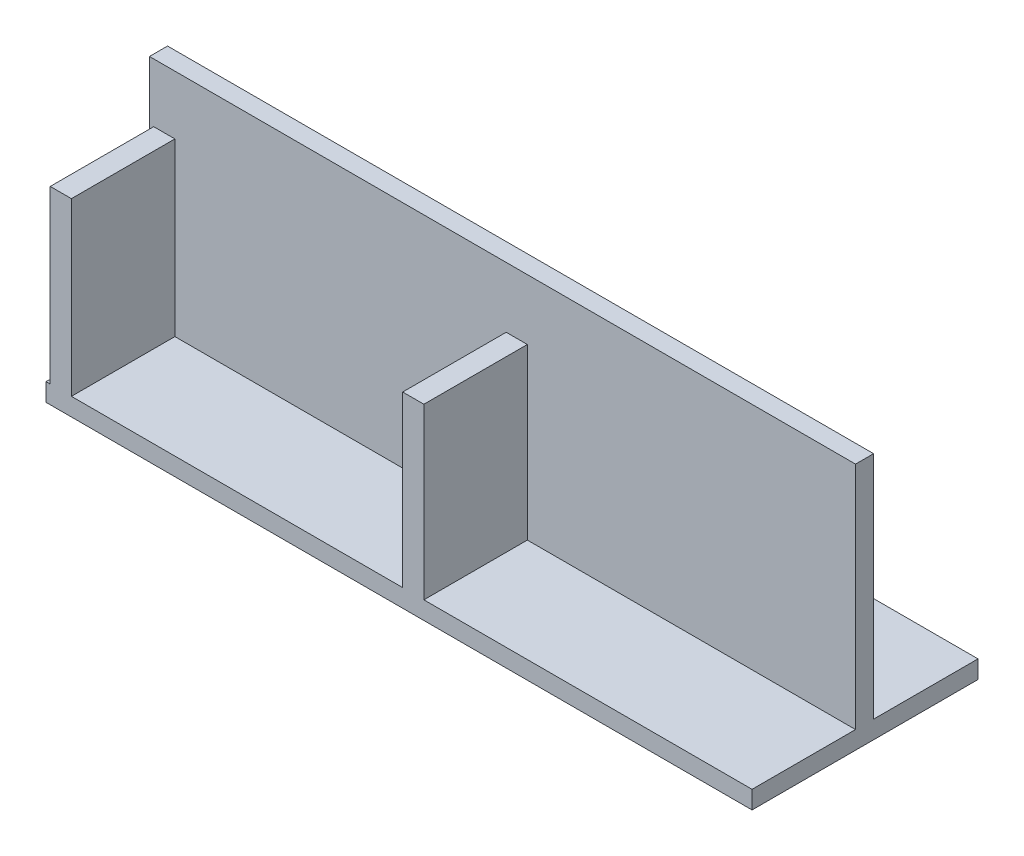
ISO-10303-21;
HEADER;
FILE_DESCRIPTION(('STEP AP214'),'2;1');
FILE_NAME('part.step','',(''),(''),'','','');
FILE_SCHEMA(('AUTOMOTIVE_DESIGN { 1 0 10303 214 1 1 1 1 }'));
ENDSEC;
DATA;
#1=APPLICATION_CONTEXT('core data for automotive mechanical design processes');
#2=APPLICATION_PROTOCOL_DEFINITION('international standard','automotive_design',2000,#1);
#3=PRODUCT_CONTEXT('',#1,'mechanical');
#4=PRODUCT('Part','Part','',(#3));
#5=PRODUCT_RELATED_PRODUCT_CATEGORY('part','',(#4));
#6=PRODUCT_DEFINITION_FORMATION('','',#4);
#7=PRODUCT_DEFINITION_CONTEXT('part definition',#1,'design');
#8=PRODUCT_DEFINITION('design','',#6,#7);
#9=PRODUCT_DEFINITION_SHAPE('','',#8);
#10=(LENGTH_UNIT() NAMED_UNIT(*) SI_UNIT(.MILLI.,.METRE.));
#11=(NAMED_UNIT(*) PLANE_ANGLE_UNIT() SI_UNIT($,.RADIAN.));
#12=(NAMED_UNIT(*) SI_UNIT($,.STERADIAN.) SOLID_ANGLE_UNIT());
#13=UNCERTAINTY_MEASURE_WITH_UNIT(LENGTH_MEASURE(1.E-05),#10,'distance_accuracy_value','');
#14=(GEOMETRIC_REPRESENTATION_CONTEXT(3) GLOBAL_UNCERTAINTY_ASSIGNED_CONTEXT((#13)) GLOBAL_UNIT_ASSIGNED_CONTEXT((#10,
#11,#12)) REPRESENTATION_CONTEXT('',''));
#15=CARTESIAN_POINT('',(0.,0.,0.));
#16=DIRECTION('',(0.,0.,1.));
#17=DIRECTION('',(1.,0.,0.));
#18=AXIS2_PLACEMENT_3D('',#15,#16,#17);
#19=CARTESIAN_POINT('',(0.,8.0518,0.));
#20=DIRECTION('',(0.,-1.,0.));
#21=DIRECTION('',(0.,0.,-1.));
#22=AXIS2_PLACEMENT_3D('',#19,#20,#21);
#23=PLANE('',#22);
#24=DIRECTION('',(0.,0.,-1.));
#25=VECTOR('',#24,1.);
#26=CARTESIAN_POINT('',(169.926,8.0518,0.));
#27=LINE('',#26,#25);
#28=CARTESIAN_POINT('',(169.926,8.0518,0.));
#29=VERTEX_POINT('',#28);
#30=CARTESIAN_POINT('',(169.926,8.0518,-46.5328));
#31=VERTEX_POINT('',#30);
#32=EDGE_CURVE('E173',#29,#31,#27,.T.);
#33=ORIENTED_EDGE('',*,*,#32,.F.);
#34=DIRECTION('',(1.,0.,0.));
#35=VECTOR('',#34,1.);
#36=CARTESIAN_POINT('',(0.,8.0518,0.));
#37=LINE('',#36,#35);
#38=CARTESIAN_POINT('',(317.5,8.0518,0.));
#39=VERTEX_POINT('',#38);
#40=EDGE_CURVE('E160',#29,#39,#37,.T.);
#41=ORIENTED_EDGE('',*,*,#40,.T.);
#42=DIRECTION('',(0.,0.,-1.));
#43=VECTOR('',#42,1.);
#44=CARTESIAN_POINT('',(317.5,8.0518,0.));
#45=LINE('',#44,#43);
#46=CARTESIAN_POINT('',(317.5,8.0518,-46.5328));
#47=VERTEX_POINT('',#46);
#48=EDGE_CURVE('E243',#39,#47,#45,.T.);
#49=ORIENTED_EDGE('',*,*,#48,.T.);
#50=DIRECTION('',(1.,0.,0.));
#51=VECTOR('',#50,1.);
#52=CARTESIAN_POINT('',(0.,8.0518,-46.5328));
#53=LINE('',#52,#51);
#54=EDGE_CURVE('E219',#31,#47,#53,.T.);
#55=ORIENTED_EDGE('',*,*,#54,.F.);
#56=EDGE_LOOP('',(#33,#41,#49,#55));
#57=FACE_BOUND('',#56,.T.);
#58=ADVANCED_FACE('F33',(#57),#23,.F.);
#59=CARTESIAN_POINT('',(11.43,8.0518,0.));
#60=VERTEX_POINT('',#59);
#61=CARTESIAN_POINT('',(160.401,8.0518,0.));
#62=VERTEX_POINT('',#61);
#63=EDGE_CURVE('E242',#60,#62,#37,.T.);
#64=ORIENTED_EDGE('',*,*,#63,.T.);
#65=DIRECTION('',(0.,0.,-1.));
#66=VECTOR('',#65,1.);
#67=CARTESIAN_POINT('',(160.401,8.0518,0.));
#68=LINE('',#67,#66);
#69=CARTESIAN_POINT('',(160.401,8.0518,-46.5328));
#70=VERTEX_POINT('',#69);
#71=EDGE_CURVE('E169',#62,#70,#68,.T.);
#72=ORIENTED_EDGE('',*,*,#71,.T.);
#73=CARTESIAN_POINT('',(11.43,8.0518,-46.5328));
#74=VERTEX_POINT('',#73);
#75=EDGE_CURVE('E222',#74,#70,#53,.T.);
#76=ORIENTED_EDGE('',*,*,#75,.F.);
#77=DIRECTION('',(0.,0.,-1.));
#78=VECTOR('',#77,1.);
#79=CARTESIAN_POINT('',(11.43,8.0518,0.));
#80=LINE('',#79,#78);
#81=EDGE_CURVE('E177',#60,#74,#80,.T.);
#82=ORIENTED_EDGE('',*,*,#81,.F.);
#83=EDGE_LOOP('',(#64,#72,#76,#82));
#84=FACE_BOUND('',#83,.T.);
#85=ADVANCED_FACE('F298',(#84),#23,.F.);
#86=CARTESIAN_POINT('',(0.,111.4298,-46.5328));
#87=DIRECTION('',(0.,0.,-1.));
#88=DIRECTION('',(-1.,0.,0.));
#89=AXIS2_PLACEMENT_3D('',#86,#87,#88);
#90=PLANE('',#89);
#91=ORIENTED_EDGE('',*,*,#75,.T.);
#92=DIRECTION('',(0.,-1.,0.));
#93=VECTOR('',#92,1.);
#94=CARTESIAN_POINT('',(160.401,84.2264,-46.5328));
#95=LINE('',#94,#93);
#96=CARTESIAN_POINT('',(160.401,84.2264,-46.5328));
#97=VERTEX_POINT('',#96);
#98=EDGE_CURVE('E53',#97,#70,#95,.T.);
#99=ORIENTED_EDGE('',*,*,#98,.F.);
#100=DIRECTION('',(1.,0.,0.));
#101=VECTOR('',#100,1.);
#102=CARTESIAN_POINT('',(0.,84.2264,-46.5328));
#103=LINE('',#102,#101);
#104=CARTESIAN_POINT('',(169.926,84.2264,-46.5328));
#105=VERTEX_POINT('',#104);
#106=EDGE_CURVE('E48',#97,#105,#103,.T.);
#107=ORIENTED_EDGE('',*,*,#106,.T.);
#108=DIRECTION('',(0.,-1.,0.));
#109=VECTOR('',#108,1.);
#110=CARTESIAN_POINT('',(169.926,84.2264,-46.5328));
#111=LINE('',#110,#109);
#112=EDGE_CURVE('E165',#105,#31,#111,.T.);
#113=ORIENTED_EDGE('',*,*,#112,.T.);
#114=ORIENTED_EDGE('',*,*,#54,.T.);
#115=DIRECTION('',(0.,-1.,0.));
#116=VECTOR('',#115,1.);
#117=CARTESIAN_POINT('',(317.5,111.4298,-46.5328));
#118=LINE('',#117,#116);
#119=CARTESIAN_POINT('',(317.5,111.4298,-46.5328));
#120=VERTEX_POINT('',#119);
#121=EDGE_CURVE('E225',#120,#47,#118,.T.);
#122=ORIENTED_EDGE('',*,*,#121,.F.);
#123=DIRECTION('',(1.,0.,0.));
#124=VECTOR('',#123,1.);
#125=CARTESIAN_POINT('',(0.,111.4298,-46.5328));
#126=LINE('',#125,#124);
#127=CARTESIAN_POINT('',(0.,111.4298,-46.5328));
#128=VERTEX_POINT('',#127);
#129=EDGE_CURVE('E212',#128,#120,#126,.T.);
#130=ORIENTED_EDGE('',*,*,#129,.F.);
#131=DIRECTION('',(0.,-1.,0.));
#132=VECTOR('',#131,1.);
#133=CARTESIAN_POINT('',(0.,111.4298,-46.5328));
#134=LINE('',#133,#132);
#135=CARTESIAN_POINT('',(0.,8.0518,-46.5328));
#136=VERTEX_POINT('',#135);
#137=EDGE_CURVE('E228',#128,#136,#134,.T.);
#138=ORIENTED_EDGE('',*,*,#137,.T.);
#139=CARTESIAN_POINT('',(1.905,8.0518,-46.5328));
#140=VERTEX_POINT('',#139);
#141=EDGE_CURVE('E210',#136,#140,#53,.T.);
#142=ORIENTED_EDGE('',*,*,#141,.T.);
#143=DIRECTION('',(0.,-1.,0.));
#144=VECTOR('',#143,1.);
#145=CARTESIAN_POINT('',(1.905,85.0392,-46.5328));
#146=LINE('',#145,#144);
#147=CARTESIAN_POINT('',(1.905,85.0392,-46.5328));
#148=VERTEX_POINT('',#147);
#149=EDGE_CURVE('E198',#148,#140,#146,.T.);
#150=ORIENTED_EDGE('',*,*,#149,.F.);
#151=DIRECTION('',(1.,0.,0.));
#152=VECTOR('',#151,1.);
#153=CARTESIAN_POINT('',(0.,85.0392,-46.5328));
#154=LINE('',#153,#152);
#155=CARTESIAN_POINT('',(11.43,85.0392,-46.5328));
#156=VERTEX_POINT('',#155);
#157=EDGE_CURVE('E187',#148,#156,#154,.T.);
#158=ORIENTED_EDGE('',*,*,#157,.T.);
#159=DIRECTION('',(0.,-1.,0.));
#160=VECTOR('',#159,1.);
#161=CARTESIAN_POINT('',(11.43,85.0392,-46.5328));
#162=LINE('',#161,#160);
#163=EDGE_CURVE('E200',#156,#74,#162,.T.);
#164=ORIENTED_EDGE('',*,*,#163,.T.);
#165=EDGE_LOOP('',(#91,#99,#107,#113,#114,#122,#130,#138,#142,#150,#158,#164));
#166=FACE_BOUND('',#165,.T.);
#167=ADVANCED_FACE('F292',(#166),#90,.F.);
#168=DIRECTION('',(-1.,0.,0.));
#169=VECTOR('',#168,1.);
#170=CARTESIAN_POINT('',(0.,8.0518,-54.6608));
#171=LINE('',#170,#169);
#172=CARTESIAN_POINT('',(317.5,8.0518,-54.6608));
#173=VERTEX_POINT('',#172);
#174=CARTESIAN_POINT('',(0.,8.0518,-54.6608));
#175=VERTEX_POINT('',#174);
#176=EDGE_CURVE('E205',#173,#175,#171,.T.);
#177=ORIENTED_EDGE('',*,*,#176,.F.);
#178=CARTESIAN_POINT('',(317.5,8.0518,-101.6));
#179=VERTEX_POINT('',#178);
#180=EDGE_CURVE('E241',#173,#179,#45,.T.);
#181=ORIENTED_EDGE('',*,*,#180,.T.);
#182=DIRECTION('',(-1.,0.,0.));
#183=VECTOR('',#182,1.);
#184=CARTESIAN_POINT('',(0.,8.0518,-101.6));
#185=LINE('',#184,#183);
#186=CARTESIAN_POINT('',(0.,8.0518,-101.6));
#187=VERTEX_POINT('',#186);
#188=EDGE_CURVE('E246',#179,#187,#185,.T.);
#189=ORIENTED_EDGE('',*,*,#188,.T.);
#190=DIRECTION('',(0.,0.,1.));
#191=VECTOR('',#190,1.);
#192=CARTESIAN_POINT('',(0.,8.0518,0.));
#193=LINE('',#192,#191);
#194=EDGE_CURVE('E235',#187,#175,#193,.T.);
#195=ORIENTED_EDGE('',*,*,#194,.T.);
#196=EDGE_LOOP('',(#177,#181,#189,#195));
#197=FACE_BOUND('',#196,.T.);
#198=ADVANCED_FACE('F280',(#197),#23,.F.);
#199=CARTESIAN_POINT('',(0.,8.0518,0.));
#200=VERTEX_POINT('',#199);
#201=CARTESIAN_POINT('',(1.905,8.0518,0.));
#202=VERTEX_POINT('',#201);
#203=EDGE_CURVE('E238',#200,#202,#37,.T.);
#204=ORIENTED_EDGE('',*,*,#203,.T.);
#205=DIRECTION('',(0.,0.,-1.));
#206=VECTOR('',#205,1.);
#207=CARTESIAN_POINT('',(1.905,8.0518,0.));
#208=LINE('',#207,#206);
#209=EDGE_CURVE('E184',#202,#140,#208,.T.);
#210=ORIENTED_EDGE('',*,*,#209,.T.);
#211=ORIENTED_EDGE('',*,*,#141,.F.);
#212=EDGE_CURVE('E237',#136,#200,#193,.T.);
#213=ORIENTED_EDGE('',*,*,#212,.T.);
#214=EDGE_LOOP('',(#204,#210,#211,#213));
#215=FACE_BOUND('',#214,.T.);
#216=ADVANCED_FACE('F321',(#215),#23,.F.);
#217=CARTESIAN_POINT('',(0.,8.0518,0.));
#218=DIRECTION('',(1.,0.,0.));
#219=DIRECTION('',(0.,0.,-1.));
#220=AXIS2_PLACEMENT_3D('',#217,#218,#219);
#221=PLANE('',#220);
#222=DIRECTION('',(0.,0.,1.));
#223=VECTOR('',#222,1.);
#224=CARTESIAN_POINT('',(0.,0.,0.));
#225=LINE('',#224,#223);
#226=CARTESIAN_POINT('',(0.,0.,-101.6));
#227=VERTEX_POINT('',#226);
#228=CARTESIAN_POINT('',(0.,0.,0.));
#229=VERTEX_POINT('',#228);
#230=EDGE_CURVE('E234',#227,#229,#225,.T.);
#231=ORIENTED_EDGE('',*,*,#230,.T.);
#232=DIRECTION('',(0.,-1.,0.));
#233=VECTOR('',#232,1.);
#234=CARTESIAN_POINT('',(0.,8.0518,0.));
#235=LINE('',#234,#233);
#236=EDGE_CURVE('E11',#200,#229,#235,.T.);
#237=ORIENTED_EDGE('',*,*,#236,.F.);
#238=ORIENTED_EDGE('',*,*,#212,.F.);
#239=ORIENTED_EDGE('',*,*,#137,.F.);
#240=DIRECTION('',(0.,0.,1.));
#241=VECTOR('',#240,1.);
#242=CARTESIAN_POINT('',(0.,111.4298,0.));
#243=LINE('',#242,#241);
#244=CARTESIAN_POINT('',(0.,111.4298,-54.6608));
#245=VERTEX_POINT('',#244);
#246=EDGE_CURVE('E209',#245,#128,#243,.T.);
#247=ORIENTED_EDGE('',*,*,#246,.F.);
#248=DIRECTION('',(0.,-1.,0.));
#249=VECTOR('',#248,1.);
#250=CARTESIAN_POINT('',(0.,111.4298,-54.6608));
#251=LINE('',#250,#249);
#252=EDGE_CURVE('E231',#245,#175,#251,.T.);
#253=ORIENTED_EDGE('',*,*,#252,.T.);
#254=ORIENTED_EDGE('',*,*,#194,.F.);
#255=DIRECTION('',(0.,-1.,0.));
#256=VECTOR('',#255,1.);
#257=CARTESIAN_POINT('',(0.,8.0518,-101.6));
#258=LINE('',#257,#256);
#259=EDGE_CURVE('E248',#187,#227,#258,.T.);
#260=ORIENTED_EDGE('',*,*,#259,.T.);
#261=EDGE_LOOP('',(#231,#237,#238,#239,#247,#253,#254,#260));
#262=FACE_BOUND('',#261,.T.);
#263=ADVANCED_FACE('F35',(#262),#221,.F.);
#264=CARTESIAN_POINT('',(0.,8.0518,0.));
#265=DIRECTION('',(0.,0.,-1.));
#266=DIRECTION('',(-1.,0.,0.));
#267=AXIS2_PLACEMENT_3D('',#264,#265,#266);
#268=PLANE('',#267);
#269=DIRECTION('',(1.,0.,0.));
#270=VECTOR('',#269,1.);
#271=CARTESIAN_POINT('',(0.,0.,0.));
#272=LINE('',#271,#270);
#273=CARTESIAN_POINT('',(317.5,0.,0.));
#274=VERTEX_POINT('',#273);
#275=EDGE_CURVE('E251',#229,#274,#272,.T.);
#276=ORIENTED_EDGE('',*,*,#275,.T.);
#277=DIRECTION('',(0.,-1.,0.));
#278=VECTOR('',#277,1.);
#279=CARTESIAN_POINT('',(317.5,8.0518,0.));
#280=LINE('',#279,#278);
#281=EDGE_CURVE('E41',#39,#274,#280,.T.);
#282=ORIENTED_EDGE('',*,*,#281,.F.);
#283=ORIENTED_EDGE('',*,*,#40,.F.);
#284=DIRECTION('',(0.,-1.,0.));
#285=VECTOR('',#284,1.);
#286=CARTESIAN_POINT('',(169.926,84.2264,0.));
#287=LINE('',#286,#285);
#288=CARTESIAN_POINT('',(169.926,84.2264,0.));
#289=VERTEX_POINT('',#288);
#290=EDGE_CURVE('E157',#289,#29,#287,.T.);
#291=ORIENTED_EDGE('',*,*,#290,.F.);
#292=DIRECTION('',(1.,0.,0.));
#293=VECTOR('',#292,1.);
#294=CARTESIAN_POINT('',(0.,84.2264,0.));
#295=LINE('',#294,#293);
#296=CARTESIAN_POINT('',(160.401,84.2264,0.));
#297=VERTEX_POINT('',#296);
#298=EDGE_CURVE('E145',#297,#289,#295,.T.);
#299=ORIENTED_EDGE('',*,*,#298,.F.);
#300=DIRECTION('',(0.,-1.,0.));
#301=VECTOR('',#300,1.);
#302=CARTESIAN_POINT('',(160.401,84.2264,0.));
#303=LINE('',#302,#301);
#304=EDGE_CURVE('E164',#297,#62,#303,.T.);
#305=ORIENTED_EDGE('',*,*,#304,.T.);
#306=ORIENTED_EDGE('',*,*,#63,.F.);
#307=DIRECTION('',(0.,-1.,0.));
#308=VECTOR('',#307,1.);
#309=CARTESIAN_POINT('',(11.43,85.0392,0.));
#310=LINE('',#309,#308);
#311=CARTESIAN_POINT('',(11.43,85.0392,0.));
#312=VERTEX_POINT('',#311);
#313=EDGE_CURVE('E203',#312,#60,#310,.T.);
#314=ORIENTED_EDGE('',*,*,#313,.F.);
#315=DIRECTION('',(1.,0.,0.));
#316=VECTOR('',#315,1.);
#317=CARTESIAN_POINT('',(0.,85.0392,0.));
#318=LINE('',#317,#316);
#319=CARTESIAN_POINT('',(1.905,85.0392,0.));
#320=VERTEX_POINT('',#319);
#321=EDGE_CURVE('E180',#320,#312,#318,.T.);
#322=ORIENTED_EDGE('',*,*,#321,.F.);
#323=DIRECTION('',(0.,-1.,0.));
#324=VECTOR('',#323,1.);
#325=CARTESIAN_POINT('',(1.905,85.0392,0.));
#326=LINE('',#325,#324);
#327=EDGE_CURVE('E193',#320,#202,#326,.T.);
#328=ORIENTED_EDGE('',*,*,#327,.T.);
#329=ORIENTED_EDGE('',*,*,#203,.F.);
#330=ORIENTED_EDGE('',*,*,#236,.T.);
#331=EDGE_LOOP('',(#276,#282,#283,#291,#299,#305,#306,#314,#322,#328,#329,#330));
#332=FACE_BOUND('',#331,.T.);
#333=ADVANCED_FACE('F158',(#332),#268,.F.);
#334=CARTESIAN_POINT('',(317.5,8.0518,0.));
#335=DIRECTION('',(-1.,0.,0.));
#336=DIRECTION('',(0.,0.,1.));
#337=AXIS2_PLACEMENT_3D('',#334,#335,#336);
#338=PLANE('',#337);
#339=DIRECTION('',(0.,0.,-1.));
#340=VECTOR('',#339,1.);
#341=CARTESIAN_POINT('',(317.5,0.,0.));
#342=LINE('',#341,#340);
#343=CARTESIAN_POINT('',(317.5,0.,-101.6));
#344=VERTEX_POINT('',#343);
#345=EDGE_CURVE('E253',#274,#344,#342,.T.);
#346=ORIENTED_EDGE('',*,*,#345,.T.);
#347=DIRECTION('',(0.,-1.,0.));
#348=VECTOR('',#347,1.);
#349=CARTESIAN_POINT('',(317.5,8.0518,-101.6));
#350=LINE('',#349,#348);
#351=EDGE_CURVE('E259',#179,#344,#350,.T.);
#352=ORIENTED_EDGE('',*,*,#351,.F.);
#353=ORIENTED_EDGE('',*,*,#180,.F.);
#354=DIRECTION('',(0.,-1.,0.));
#355=VECTOR('',#354,1.);
#356=CARTESIAN_POINT('',(317.5,111.4298,-54.6608));
#357=LINE('',#356,#355);
#358=CARTESIAN_POINT('',(317.5,111.4298,-54.6608));
#359=VERTEX_POINT('',#358);
#360=EDGE_CURVE('E216',#359,#173,#357,.T.);
#361=ORIENTED_EDGE('',*,*,#360,.F.);
#362=DIRECTION('',(0.,0.,-1.));
#363=VECTOR('',#362,1.);
#364=CARTESIAN_POINT('',(317.5,111.4298,0.));
#365=LINE('',#364,#363);
#366=EDGE_CURVE('E214',#120,#359,#365,.T.);
#367=ORIENTED_EDGE('',*,*,#366,.F.);
#368=ORIENTED_EDGE('',*,*,#121,.T.);
#369=ORIENTED_EDGE('',*,*,#48,.F.);
#370=ORIENTED_EDGE('',*,*,#281,.T.);
#371=EDGE_LOOP('',(#346,#352,#353,#361,#367,#368,#369,#370));
#372=FACE_BOUND('',#371,.T.);
#373=ADVANCED_FACE('F265',(#372),#338,.F.);
#374=CARTESIAN_POINT('',(0.,8.0518,-101.6));
#375=DIRECTION('',(0.,0.,1.));
#376=DIRECTION('',(1.,0.,0.));
#377=AXIS2_PLACEMENT_3D('',#374,#375,#376);
#378=PLANE('',#377);
#379=DIRECTION('',(-1.,0.,0.));
#380=VECTOR('',#379,1.);
#381=CARTESIAN_POINT('',(0.,0.,-101.6));
#382=LINE('',#381,#380);
#383=EDGE_CURVE('E255',#344,#227,#382,.T.);
#384=ORIENTED_EDGE('',*,*,#383,.T.);
#385=ORIENTED_EDGE('',*,*,#259,.F.);
#386=ORIENTED_EDGE('',*,*,#188,.F.);
#387=ORIENTED_EDGE('',*,*,#351,.T.);
#388=EDGE_LOOP('',(#384,#385,#386,#387));
#389=FACE_BOUND('',#388,.T.);
#390=ADVANCED_FACE('F273',(#389),#378,.F.);
#391=CARTESIAN_POINT('',(0.,0.,0.));
#392=DIRECTION('',(0.,-1.,0.));
#393=DIRECTION('',(0.,0.,-1.));
#394=AXIS2_PLACEMENT_3D('',#391,#392,#393);
#395=PLANE('',#394);
#396=ORIENTED_EDGE('',*,*,#230,.F.);
#397=ORIENTED_EDGE('',*,*,#383,.F.);
#398=ORIENTED_EDGE('',*,*,#345,.F.);
#399=ORIENTED_EDGE('',*,*,#275,.F.);
#400=EDGE_LOOP('',(#396,#397,#398,#399));
#401=FACE_BOUND('',#400,.T.);
#402=ADVANCED_FACE('F270',(#401),#395,.T.);
#403=CARTESIAN_POINT('',(0.,111.4298,-54.6608));
#404=DIRECTION('',(0.,0.,1.));
#405=DIRECTION('',(1.,0.,0.));
#406=AXIS2_PLACEMENT_3D('',#403,#404,#405);
#407=PLANE('',#406);
#408=ORIENTED_EDGE('',*,*,#176,.T.);
#409=ORIENTED_EDGE('',*,*,#252,.F.);
#410=DIRECTION('',(-1.,0.,0.));
#411=VECTOR('',#410,1.);
#412=CARTESIAN_POINT('',(0.,111.4298,-54.6608));
#413=LINE('',#412,#411);
#414=EDGE_CURVE('E206',#359,#245,#413,.T.);
#415=ORIENTED_EDGE('',*,*,#414,.F.);
#416=ORIENTED_EDGE('',*,*,#360,.T.);
#417=EDGE_LOOP('',(#408,#409,#415,#416));
#418=FACE_BOUND('',#417,.T.);
#419=ADVANCED_FACE('F286',(#418),#407,.F.);
#420=CARTESIAN_POINT('',(0.,111.4298,0.));
#421=DIRECTION('',(0.,1.,0.));
#422=DIRECTION('',(0.,0.,1.));
#423=AXIS2_PLACEMENT_3D('',#420,#421,#422);
#424=PLANE('',#423);
#425=ORIENTED_EDGE('',*,*,#414,.T.);
#426=ORIENTED_EDGE('',*,*,#246,.T.);
#427=ORIENTED_EDGE('',*,*,#129,.T.);
#428=ORIENTED_EDGE('',*,*,#366,.T.);
#429=EDGE_LOOP('',(#425,#426,#427,#428));
#430=FACE_BOUND('',#429,.T.);
#431=ADVANCED_FACE('F288',(#430),#424,.T.);
#432=CARTESIAN_POINT('',(11.43,85.0392,0.));
#433=DIRECTION('',(-1.,0.,0.));
#434=DIRECTION('',(0.,0.,1.));
#435=AXIS2_PLACEMENT_3D('',#432,#433,#434);
#436=PLANE('',#435);
#437=ORIENTED_EDGE('',*,*,#81,.T.);
#438=ORIENTED_EDGE('',*,*,#163,.F.);
#439=DIRECTION('',(0.,0.,-1.));
#440=VECTOR('',#439,1.);
#441=CARTESIAN_POINT('',(11.43,85.0392,0.));
#442=LINE('',#441,#440);
#443=EDGE_CURVE('E183',#312,#156,#442,.T.);
#444=ORIENTED_EDGE('',*,*,#443,.F.);
#445=ORIENTED_EDGE('',*,*,#313,.T.);
#446=EDGE_LOOP('',(#437,#438,#444,#445));
#447=FACE_BOUND('',#446,.T.);
#448=ADVANCED_FACE('F340',(#447),#436,.F.);
#449=CARTESIAN_POINT('',(1.905,85.0392,0.));
#450=DIRECTION('',(-1.,0.,0.));
#451=DIRECTION('',(0.,0.,1.));
#452=AXIS2_PLACEMENT_3D('',#449,#450,#451);
#453=PLANE('',#452);
#454=ORIENTED_EDGE('',*,*,#209,.F.);
#455=ORIENTED_EDGE('',*,*,#327,.F.);
#456=DIRECTION('',(0.,0.,-1.));
#457=VECTOR('',#456,1.);
#458=CARTESIAN_POINT('',(1.905,85.0392,0.));
#459=LINE('',#458,#457);
#460=EDGE_CURVE('E190',#320,#148,#459,.T.);
#461=ORIENTED_EDGE('',*,*,#460,.T.);
#462=ORIENTED_EDGE('',*,*,#149,.T.);
#463=EDGE_LOOP('',(#454,#455,#461,#462));
#464=FACE_BOUND('',#463,.T.);
#465=ADVANCED_FACE('F312',(#464),#453,.T.);
#466=CARTESIAN_POINT('',(0.,85.0392,0.));
#467=DIRECTION('',(0.,1.,0.));
#468=DIRECTION('',(0.,0.,1.));
#469=AXIS2_PLACEMENT_3D('',#466,#467,#468);
#470=PLANE('',#469);
#471=ORIENTED_EDGE('',*,*,#321,.T.);
#472=ORIENTED_EDGE('',*,*,#443,.T.);
#473=ORIENTED_EDGE('',*,*,#157,.F.);
#474=ORIENTED_EDGE('',*,*,#460,.F.);
#475=EDGE_LOOP('',(#471,#472,#473,#474));
#476=FACE_BOUND('',#475,.T.);
#477=ADVANCED_FACE('F305',(#476),#470,.T.);
#478=CARTESIAN_POINT('',(160.401,84.2264,0.));
#479=DIRECTION('',(-1.,0.,0.));
#480=DIRECTION('',(0.,0.,1.));
#481=AXIS2_PLACEMENT_3D('',#478,#479,#480);
#482=PLANE('',#481);
#483=ORIENTED_EDGE('',*,*,#71,.F.);
#484=ORIENTED_EDGE('',*,*,#304,.F.);
#485=DIRECTION('',(0.,0.,-1.));
#486=VECTOR('',#485,1.);
#487=CARTESIAN_POINT('',(160.401,84.2264,0.));
#488=LINE('',#487,#486);
#489=EDGE_CURVE('E152',#297,#97,#488,.T.);
#490=ORIENTED_EDGE('',*,*,#489,.T.);
#491=ORIENTED_EDGE('',*,*,#98,.T.);
#492=EDGE_LOOP('',(#483,#484,#490,#491));
#493=FACE_BOUND('',#492,.T.);
#494=ADVANCED_FACE('F303',(#493),#482,.T.);
#495=CARTESIAN_POINT('',(169.926,84.2264,0.));
#496=DIRECTION('',(-1.,0.,0.));
#497=DIRECTION('',(0.,0.,1.));
#498=AXIS2_PLACEMENT_3D('',#495,#496,#497);
#499=PLANE('',#498);
#500=ORIENTED_EDGE('',*,*,#32,.T.);
#501=ORIENTED_EDGE('',*,*,#112,.F.);
#502=DIRECTION('',(0.,0.,-1.));
#503=VECTOR('',#502,1.);
#504=CARTESIAN_POINT('',(169.926,84.2264,0.));
#505=LINE('',#504,#503);
#506=EDGE_CURVE('E149',#289,#105,#505,.T.);
#507=ORIENTED_EDGE('',*,*,#506,.F.);
#508=ORIENTED_EDGE('',*,*,#290,.T.);
#509=EDGE_LOOP('',(#500,#501,#507,#508));
#510=FACE_BOUND('',#509,.T.);
#511=ADVANCED_FACE('F167',(#510),#499,.F.);
#512=CARTESIAN_POINT('',(0.,84.2264,0.));
#513=DIRECTION('',(0.,1.,0.));
#514=DIRECTION('',(0.,0.,1.));
#515=AXIS2_PLACEMENT_3D('',#512,#513,#514);
#516=PLANE('',#515);
#517=ORIENTED_EDGE('',*,*,#106,.F.);
#518=ORIENTED_EDGE('',*,*,#489,.F.);
#519=ORIENTED_EDGE('',*,*,#298,.T.);
#520=ORIENTED_EDGE('',*,*,#506,.T.);
#521=EDGE_LOOP('',(#517,#518,#519,#520));
#522=FACE_BOUND('',#521,.T.);
#523=ADVANCED_FACE('F147',(#522),#516,.T.);
#524=CLOSED_SHELL('',(#58,#85,#167,#198,#216,#263,#333,#373,#390,#402,#419,#431,#448,#465,#477,
#494,#511,#523));
#525=MANIFOLD_SOLID_BREP('B2',#524);
#526=ADVANCED_BREP_SHAPE_REPRESENTATION('',(#18,#525),#14);
#527=SHAPE_DEFINITION_REPRESENTATION(#9,#526);
ENDSEC;
END-ISO-10303-21;
